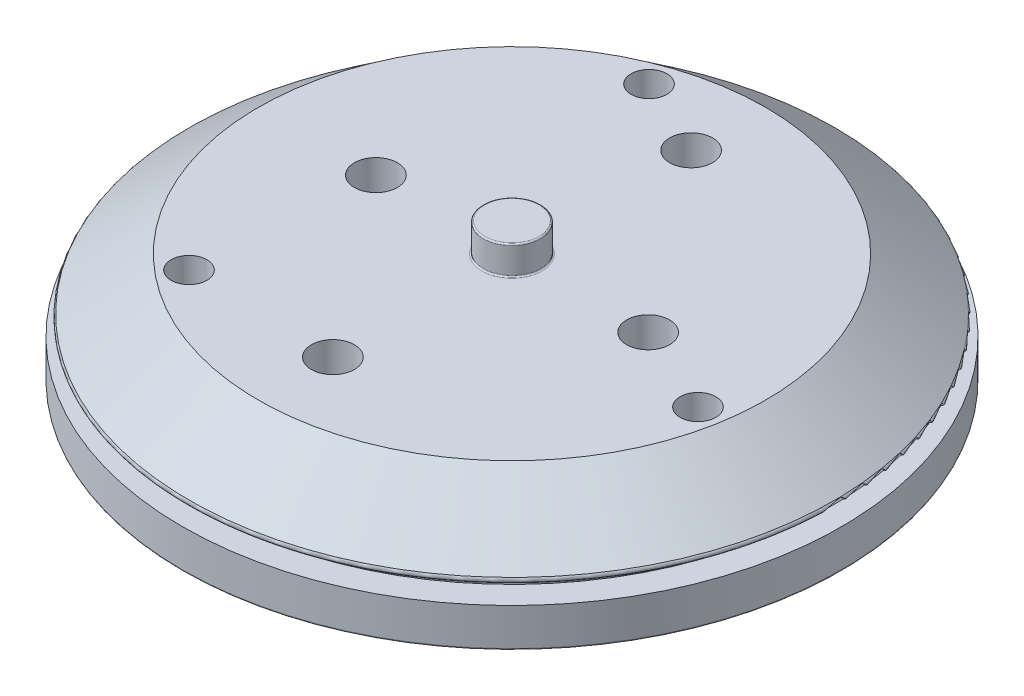
ISO-10303-21;
HEADER;
FILE_DESCRIPTION(('STEP AP214'),'2;1');
FILE_NAME('part.step','',(''),(''),'','','');
FILE_SCHEMA(('AUTOMOTIVE_DESIGN { 1 0 10303 214 1 1 1 1 }'));
ENDSEC;
DATA;
#1=APPLICATION_CONTEXT('core data for automotive mechanical design processes');
#2=APPLICATION_PROTOCOL_DEFINITION('international standard','automotive_design',2000,#1);
#3=PRODUCT_CONTEXT('',#1,'mechanical');
#4=PRODUCT('Part','Part','',(#3));
#5=PRODUCT_RELATED_PRODUCT_CATEGORY('part','',(#4));
#6=PRODUCT_DEFINITION_FORMATION('','',#4);
#7=PRODUCT_DEFINITION_CONTEXT('part definition',#1,'design');
#8=PRODUCT_DEFINITION('design','',#6,#7);
#9=PRODUCT_DEFINITION_SHAPE('','',#8);
#10=(LENGTH_UNIT() NAMED_UNIT(*) SI_UNIT(.MILLI.,.METRE.));
#11=(NAMED_UNIT(*) PLANE_ANGLE_UNIT() SI_UNIT($,.RADIAN.));
#12=(NAMED_UNIT(*) SI_UNIT($,.STERADIAN.) SOLID_ANGLE_UNIT());
#13=UNCERTAINTY_MEASURE_WITH_UNIT(LENGTH_MEASURE(1.E-05),#10,'distance_accuracy_value','');
#14=(GEOMETRIC_REPRESENTATION_CONTEXT(3) GLOBAL_UNCERTAINTY_ASSIGNED_CONTEXT((#13)) GLOBAL_UNIT_ASSIGNED_CONTEXT((#10,
#11,#12)) REPRESENTATION_CONTEXT('',''));
#15=CARTESIAN_POINT('',(0.,0.,0.));
#16=DIRECTION('',(0.,0.,1.));
#17=DIRECTION('',(1.,0.,0.));
#18=AXIS2_PLACEMENT_3D('',#15,#16,#17);
#19=CARTESIAN_POINT('',(0.,2.,0.));
#20=DIRECTION('',(0.,1.,0.));
#21=DIRECTION('',(0.,0.,1.));
#22=AXIS2_PLACEMENT_3D('',#19,#20,#21);
#23=PLANE('',#22);
#24=CARTESIAN_POINT('',(0.,2.,0.));
#25=DIRECTION('',(0.,-1.,0.));
#26=DIRECTION('',(0.,0.,-1.));
#27=AXIS2_PLACEMENT_3D('',#24,#25,#26);
#28=CIRCLE('',#27,1.9);
#29=CARTESIAN_POINT('',(0.,2.,-1.9));
#30=VERTEX_POINT('',#29);
#31=CARTESIAN_POINT('',(0.,2.,1.9));
#32=VERTEX_POINT('',#31);
#33=EDGE_CURVE('E66',#30,#32,#28,.T.);
#34=ORIENTED_EDGE('',*,*,#33,.F.);
#35=CARTESIAN_POINT('',(0.,2.,0.));
#36=DIRECTION('',(0.,-1.,0.));
#37=DIRECTION('',(0.,0.,1.));
#38=AXIS2_PLACEMENT_3D('',#35,#36,#37);
#39=CIRCLE('',#38,1.9);
#40=EDGE_CURVE('E64',#32,#30,#39,.T.);
#41=ORIENTED_EDGE('',*,*,#40,.F.);
#42=EDGE_LOOP('',(#34,#41));
#43=FACE_BOUND('',#42,.T.);
#44=ADVANCED_FACE('F24',(#43),#23,.T.);
#45=CARTESIAN_POINT('',(0.,1.9,0.));
#46=DIRECTION('',(0.,1.,0.));
#47=DIRECTION('',(0.,0.,1.));
#48=AXIS2_PLACEMENT_3D('',#45,#46,#47);
#49=TOROIDAL_SURFACE('',#48,1.9,0.1);
#50=ORIENTED_EDGE('',*,*,#40,.T.);
#51=ORIENTED_EDGE('',*,*,#33,.T.);
#52=EDGE_LOOP('',(#50,#51));
#53=FACE_BOUND('',#52,.T.);
#54=CARTESIAN_POINT('',(0.,1.9,0.));
#55=DIRECTION('',(0.,-1.,0.));
#56=DIRECTION('',(0.,0.,-1.));
#57=AXIS2_PLACEMENT_3D('',#54,#55,#56);
#58=CIRCLE('',#57,2.);
#59=CARTESIAN_POINT('',(0.,1.9,-2.));
#60=VERTEX_POINT('',#59);
#61=EDGE_CURVE('E94',#60,#60,#58,.T.);
#62=ORIENTED_EDGE('',*,*,#61,.F.);
#63=EDGE_LOOP('',(#62));
#64=FACE_BOUND('',#63,.T.);
#65=ADVANCED_FACE('F68',(#53,#64),#49,.T.);
#66=CARTESIAN_POINT('',(0.,-4.,17.7));
#67=DIRECTION('',(0.,-1.,0.));
#68=DIRECTION('',(0.,0.,-1.));
#69=AXIS2_PLACEMENT_3D('',#66,#67,#68);
#70=PLANE('',#69);
#71=CARTESIAN_POINT('',(0.,-4.,0.));
#72=DIRECTION('',(0.,1.,0.));
#73=DIRECTION('',(0.,0.,1.));
#74=AXIS2_PLACEMENT_3D('',#71,#72,#73);
#75=CIRCLE('',#74,22.4029984939793);
#76=CARTESIAN_POINT('',(0.,-4.,22.4029984939793));
#77=VERTEX_POINT('',#76);
#78=CARTESIAN_POINT('',(0.,-4.,-22.4029984939793));
#79=VERTEX_POINT('',#78);
#80=EDGE_CURVE('E164',#77,#79,#75,.T.);
#81=ORIENTED_EDGE('',*,*,#80,.F.);
#82=CARTESIAN_POINT('',(0.,-4.,0.));
#83=DIRECTION('',(0.,1.,0.));
#84=DIRECTION('',(0.,0.,-1.));
#85=AXIS2_PLACEMENT_3D('',#82,#83,#84);
#86=CIRCLE('',#85,22.4029984939793);
#87=EDGE_CURVE('E257',#79,#77,#86,.T.);
#88=ORIENTED_EDGE('',*,*,#87,.F.);
#89=EDGE_LOOP('',(#81,#88));
#90=FACE_BOUND('',#89,.T.);
#91=CARTESIAN_POINT('',(0.,-4.,0.));
#92=DIRECTION('',(0.,1.,0.));
#93=DIRECTION('',(0.,0.,1.));
#94=AXIS2_PLACEMENT_3D('',#91,#92,#93);
#95=CIRCLE('',#94,21.2);
#96=CARTESIAN_POINT('',(0.,-4.,21.2));
#97=VERTEX_POINT('',#96);
#98=EDGE_CURVE('E72',#97,#97,#95,.F.);
#99=ORIENTED_EDGE('',*,*,#98,.F.);
#100=EDGE_LOOP('',(#99));
#101=FACE_BOUND('',#100,.T.);
#102=ADVANCED_FACE('F99',(#90,#101),#70,.T.);
#103=CARTESIAN_POINT('',(0.,-5.,0.));
#104=DIRECTION('',(0.,1.,0.));
#105=DIRECTION('',(0.,0.,1.));
#106=AXIS2_PLACEMENT_3D('',#103,#104,#105);
#107=CYLINDRICAL_SURFACE('',#106,21.2);
#108=CARTESIAN_POINT('',(0.,-5.,0.));
#109=DIRECTION('',(0.,1.,0.));
#110=DIRECTION('',(0.,0.,1.));
#111=AXIS2_PLACEMENT_3D('',#108,#109,#110);
#112=CIRCLE('',#111,21.2);
#113=CARTESIAN_POINT('',(0.,-5.,21.2));
#114=VERTEX_POINT('',#113);
#115=EDGE_CURVE('E160',#114,#114,#112,.F.);
#116=ORIENTED_EDGE('',*,*,#115,.F.);
#117=EDGE_LOOP('',(#116));
#118=FACE_BOUND('',#117,.T.);
#119=ORIENTED_EDGE('',*,*,#98,.T.);
#120=EDGE_LOOP('',(#119));
#121=FACE_BOUND('',#120,.T.);
#122=ADVANCED_FACE('F308',(#118,#121),#107,.T.);
#123=CARTESIAN_POINT('',(0.,2.,0.));
#124=DIRECTION('',(0.,-1.,0.));
#125=DIRECTION('',(0.,0.,-1.));
#126=AXIS2_PLACEMENT_3D('',#123,#124,#125);
#127=CYLINDRICAL_SURFACE('',#126,2.);
#128=CARTESIAN_POINT('',(0.,0.1,0.));
#129=DIRECTION('',(0.,1.,0.));
#130=DIRECTION('',(0.,0.,1.));
#131=AXIS2_PLACEMENT_3D('',#128,#129,#130);
#132=CIRCLE('',#131,2.);
#133=CARTESIAN_POINT('',(0.,0.1,2.));
#134=VERTEX_POINT('',#133);
#135=EDGE_CURVE('E163',#134,#134,#132,.T.);
#136=ORIENTED_EDGE('',*,*,#135,.T.);
#137=EDGE_LOOP('',(#136));
#138=FACE_BOUND('',#137,.T.);
#139=ORIENTED_EDGE('',*,*,#61,.T.);
#140=EDGE_LOOP('',(#139));
#141=FACE_BOUND('',#140,.T.);
#142=ADVANCED_FACE('F271',(#138,#141),#127,.T.);
#143=CARTESIAN_POINT('',(0.,-3.8,0.));
#144=DIRECTION('',(0.,-1.,0.));
#145=DIRECTION('',(0.,0.,-1.));
#146=AXIS2_PLACEMENT_3D('',#143,#144,#145);
#147=TOROIDAL_SURFACE('',#146,22.4029984939793,0.2);
#148=ORIENTED_EDGE('',*,*,#87,.T.);
#149=ORIENTED_EDGE('',*,*,#80,.T.);
#150=EDGE_LOOP('',(#148,#149));
#151=FACE_BOUND('',#150,.T.);
#152=CARTESIAN_POINT('',(0.,-3.64036216993335,0.));
#153=DIRECTION('',(0.,-1.,0.));
#154=DIRECTION('',(0.,0.,-1.));
#155=AXIS2_PLACEMENT_3D('',#152,#153,#154);
#156=CIRCLE('',#155,22.5234798751617);
#157=CARTESIAN_POINT('',(0.,-3.64036216993335,-22.5234798751617));
#158=VERTEX_POINT('',#157);
#159=EDGE_CURVE('E159',#158,#158,#156,.F.);
#160=ORIENTED_EDGE('',*,*,#159,.F.);
#161=EDGE_LOOP('',(#160));
#162=FACE_BOUND('',#161,.T.);
#163=ADVANCED_FACE('F261',(#151,#162),#147,.T.);
#164=CARTESIAN_POINT('',(0.,-5.,0.));
#165=DIRECTION('',(0.,1.,0.));
#166=DIRECTION('',(0.,0.,1.));
#167=AXIS2_PLACEMENT_3D('',#164,#165,#166);
#168=PLANE('',#167);
#169=CARTESIAN_POINT('',(0.,-5.,0.));
#170=DIRECTION('',(0.,1.,0.));
#171=DIRECTION('',(0.,0.,1.));
#172=AXIS2_PLACEMENT_3D('',#169,#170,#171);
#173=CIRCLE('',#172,23.);
#174=CARTESIAN_POINT('',(0.,-5.,23.));
#175=VERTEX_POINT('',#174);
#176=EDGE_CURVE('E155',#175,#175,#173,.F.);
#177=ORIENTED_EDGE('',*,*,#176,.F.);
#178=EDGE_LOOP('',(#177));
#179=FACE_BOUND('',#178,.T.);
#180=ORIENTED_EDGE('',*,*,#115,.T.);
#181=EDGE_LOOP('',(#180));
#182=FACE_BOUND('',#181,.T.);
#183=ADVANCED_FACE('F239',(#179,#182),#168,.T.);
#184=CARTESIAN_POINT('',(0.,0.1,0.));
#185=DIRECTION('',(0.,1.,0.));
#186=DIRECTION('',(0.,0.,1.));
#187=AXIS2_PLACEMENT_3D('',#184,#185,#186);
#188=TOROIDAL_SURFACE('',#187,2.1,0.1);
#189=ORIENTED_EDGE('',*,*,#135,.F.);
#190=EDGE_LOOP('',(#189));
#191=FACE_BOUND('',#190,.T.);
#192=CARTESIAN_POINT('',(0.,0.,0.));
#193=DIRECTION('',(0.,1.,0.));
#194=DIRECTION('',(0.,0.,-1.));
#195=AXIS2_PLACEMENT_3D('',#192,#193,#194);
#196=CIRCLE('',#195,2.1);
#197=CARTESIAN_POINT('',(0.,0.,2.1));
#198=VERTEX_POINT('',#197);
#199=CARTESIAN_POINT('',(0.,0.,-2.1));
#200=VERTEX_POINT('',#199);
#201=EDGE_CURVE('E158',#198,#200,#196,.F.);
#202=ORIENTED_EDGE('',*,*,#201,.F.);
#203=CARTESIAN_POINT('',(0.,0.,0.));
#204=DIRECTION('',(0.,1.,0.));
#205=DIRECTION('',(0.,0.,1.));
#206=AXIS2_PLACEMENT_3D('',#203,#204,#205);
#207=CIRCLE('',#206,2.1);
#208=EDGE_CURVE('E154',#200,#198,#207,.F.);
#209=ORIENTED_EDGE('',*,*,#208,.F.);
#210=EDGE_LOOP('',(#202,#209));
#211=FACE_BOUND('',#210,.T.);
#212=ADVANCED_FACE('F233',(#191,#211),#188,.F.);
#213=CARTESIAN_POINT('',(0.,-3.64036216993335,0.));
#214=DIRECTION('',(0.,-1.,0.));
#215=DIRECTION('',(0.,0.,-1.));
#216=AXIS2_PLACEMENT_3D('',#213,#214,#215);
#217=CONICAL_SURFACE('',#216,22.5234798751617,0.924283178917661);
#218=ORIENTED_EDGE('',*,*,#159,.T.);
#219=EDGE_LOOP('',(#218));
#220=FACE_BOUND('',#219,.T.);
#221=CARTESIAN_POINT('',(0.,0.,0.));
#222=DIRECTION('',(0.,-1.,0.));
#223=DIRECTION('',(0.,0.,-1.));
#224=AXIS2_PLACEMENT_3D('',#221,#222,#223);
#225=CIRCLE('',#224,17.7);
#226=CARTESIAN_POINT('',(0.,0.,-17.7));
#227=VERTEX_POINT('',#226);
#228=EDGE_CURVE('E151',#227,#227,#225,.F.);
#229=ORIENTED_EDGE('',*,*,#228,.F.);
#230=EDGE_LOOP('',(#229));
#231=FACE_BOUND('',#230,.T.);
#232=ADVANCED_FACE('F238',(#220,#231),#217,.T.);
#233=CARTESIAN_POINT('',(0.,-7.7,0.));
#234=DIRECTION('',(0.,1.,0.));
#235=DIRECTION('',(0.,0.,1.));
#236=AXIS2_PLACEMENT_3D('',#233,#234,#235);
#237=CYLINDRICAL_SURFACE('',#236,23.);
#238=CARTESIAN_POINT('',(0.,-7.6,0.));
#239=DIRECTION('',(0.,1.,0.));
#240=DIRECTION('',(0.,0.,1.));
#241=AXIS2_PLACEMENT_3D('',#238,#239,#240);
#242=CIRCLE('',#241,23.);
#243=CARTESIAN_POINT('',(0.,-7.6,23.));
#244=VERTEX_POINT('',#243);
#245=EDGE_CURVE('E150',#244,#244,#242,.F.);
#246=ORIENTED_EDGE('',*,*,#245,.F.);
#247=EDGE_LOOP('',(#246));
#248=FACE_BOUND('',#247,.T.);
#249=ORIENTED_EDGE('',*,*,#176,.T.);
#250=EDGE_LOOP('',(#249));
#251=FACE_BOUND('',#250,.T.);
#252=ADVANCED_FACE('F366',(#248,#251),#237,.T.);
#253=CARTESIAN_POINT('',(0.,0.,0.));
#254=DIRECTION('',(0.,1.,0.));
#255=DIRECTION('',(0.,0.,1.));
#256=AXIS2_PLACEMENT_3D('',#253,#254,#255);
#257=PLANE('',#256);
#258=ORIENTED_EDGE('',*,*,#228,.T.);
#259=EDGE_LOOP('',(#258));
#260=FACE_BOUND('',#259,.T.);
#261=CARTESIAN_POINT('',(-5.47232229321071,0.,-15.0350819325745));
#262=DIRECTION('',(0.,1.,0.));
#263=DIRECTION('',(0.,0.,1.));
#264=AXIS2_PLACEMENT_3D('',#261,#262,#263);
#265=CIRCLE('',#264,1.25);
#266=CARTESIAN_POINT('',(-5.47232229321071,0.,-13.7850819325745));
#267=VERTEX_POINT('',#266);
#268=EDGE_CURVE('E128',#267,#267,#265,.F.);
#269=ORIENTED_EDGE('',*,*,#268,.T.);
#270=EDGE_LOOP('',(#269));
#271=FACE_BOUND('',#270,.T.);
#272=CARTESIAN_POINT('',(15.7569240481954,0.,2.77837084267073));
#273=DIRECTION('',(0.,1.,0.));
#274=DIRECTION('',(0.,0.,1.));
#275=AXIS2_PLACEMENT_3D('',#272,#273,#274);
#276=CIRCLE('',#275,1.25);
#277=CARTESIAN_POINT('',(15.7569240481954,0.,4.02837084267073));
#278=VERTEX_POINT('',#277);
#279=EDGE_CURVE('E132',#278,#278,#276,.F.);
#280=ORIENTED_EDGE('',*,*,#279,.T.);
#281=EDGE_LOOP('',(#280));
#282=FACE_BOUND('',#281,.T.);
#283=CARTESIAN_POINT('',(-10.2846017549846,0.,12.2567110899037));
#284=DIRECTION('',(0.,1.,0.));
#285=DIRECTION('',(0.,0.,1.));
#286=AXIS2_PLACEMENT_3D('',#283,#284,#285);
#287=CIRCLE('',#286,1.25);
#288=CARTESIAN_POINT('',(-10.2846017549846,0.,13.5067110899037));
#289=VERTEX_POINT('',#288);
#290=EDGE_CURVE('E135',#289,#289,#287,.F.);
#291=ORIENTED_EDGE('',*,*,#290,.T.);
#292=EDGE_LOOP('',(#291));
#293=FACE_BOUND('',#292,.T.);
#294=CARTESIAN_POINT('',(0.,0.,-12.5));
#295=DIRECTION('',(0.,1.,0.));
#296=DIRECTION('',(0.,0.,1.));
#297=AXIS2_PLACEMENT_3D('',#294,#295,#296);
#298=CIRCLE('',#297,1.5);
#299=CARTESIAN_POINT('',(0.,0.,-11.));
#300=VERTEX_POINT('',#299);
#301=EDGE_CURVE('E138',#300,#300,#298,.F.);
#302=ORIENTED_EDGE('',*,*,#301,.T.);
#303=EDGE_LOOP('',(#302));
#304=FACE_BOUND('',#303,.T.);
#305=CARTESIAN_POINT('',(9.5,0.,0.));
#306=DIRECTION('',(0.,1.,0.));
#307=DIRECTION('',(0.,0.,1.));
#308=AXIS2_PLACEMENT_3D('',#305,#306,#307);
#309=CIRCLE('',#308,1.5);
#310=CARTESIAN_POINT('',(9.5,0.,1.5));
#311=VERTEX_POINT('',#310);
#312=EDGE_CURVE('E141',#311,#311,#309,.F.);
#313=ORIENTED_EDGE('',*,*,#312,.T.);
#314=EDGE_LOOP('',(#313));
#315=FACE_BOUND('',#314,.T.);
#316=CARTESIAN_POINT('',(-9.5,0.,0.));
#317=DIRECTION('',(0.,1.,0.));
#318=DIRECTION('',(0.,0.,1.));
#319=AXIS2_PLACEMENT_3D('',#316,#317,#318);
#320=CIRCLE('',#319,1.5);
#321=CARTESIAN_POINT('',(-9.5,0.,1.5));
#322=VERTEX_POINT('',#321);
#323=EDGE_CURVE('E144',#322,#322,#320,.F.);
#324=ORIENTED_EDGE('',*,*,#323,.T.);
#325=EDGE_LOOP('',(#324));
#326=FACE_BOUND('',#325,.T.);
#327=CARTESIAN_POINT('',(0.,0.,12.5));
#328=DIRECTION('',(0.,1.,0.));
#329=DIRECTION('',(0.,0.,1.));
#330=AXIS2_PLACEMENT_3D('',#327,#328,#329);
#331=CIRCLE('',#330,1.5);
#332=CARTESIAN_POINT('',(0.,0.,14.));
#333=VERTEX_POINT('',#332);
#334=EDGE_CURVE('E147',#333,#333,#331,.F.);
#335=ORIENTED_EDGE('',*,*,#334,.T.);
#336=EDGE_LOOP('',(#335));
#337=FACE_BOUND('',#336,.T.);
#338=ORIENTED_EDGE('',*,*,#201,.T.);
#339=ORIENTED_EDGE('',*,*,#208,.T.);
#340=EDGE_LOOP('',(#338,#339));
#341=FACE_BOUND('',#340,.T.);
#342=ADVANCED_FACE('F187',(#260,#271,#282,#293,#304,#315,#326,#337,#341),#257,.T.);
#343=CARTESIAN_POINT('',(0.,-7.6,0.));
#344=DIRECTION('',(0.,1.,0.));
#345=DIRECTION('',(0.,0.,1.));
#346=AXIS2_PLACEMENT_3D('',#343,#344,#345);
#347=TOROIDAL_SURFACE('',#346,22.9,0.1);
#348=CARTESIAN_POINT('',(0.,-7.7,0.));
#349=DIRECTION('',(0.,1.,0.));
#350=DIRECTION('',(0.,0.,1.));
#351=AXIS2_PLACEMENT_3D('',#348,#349,#350);
#352=CIRCLE('',#351,22.9);
#353=CARTESIAN_POINT('',(0.,-7.7,22.9));
#354=VERTEX_POINT('',#353);
#355=CARTESIAN_POINT('',(0.,-7.7,-22.9));
#356=VERTEX_POINT('',#355);
#357=EDGE_CURVE('E131',#354,#356,#352,.T.);
#358=ORIENTED_EDGE('',*,*,#357,.T.);
#359=CARTESIAN_POINT('',(0.,-7.7,0.));
#360=DIRECTION('',(0.,1.,0.));
#361=DIRECTION('',(0.,0.,-1.));
#362=AXIS2_PLACEMENT_3D('',#359,#360,#361);
#363=CIRCLE('',#362,22.9);
#364=EDGE_CURVE('E43',#356,#354,#363,.T.);
#365=ORIENTED_EDGE('',*,*,#364,.T.);
#366=EDGE_LOOP('',(#358,#365));
#367=FACE_BOUND('',#366,.T.);
#368=ORIENTED_EDGE('',*,*,#245,.T.);
#369=EDGE_LOOP('',(#368));
#370=FACE_BOUND('',#369,.T.);
#371=ADVANCED_FACE('F175',(#367,#370),#347,.T.);
#372=CARTESIAN_POINT('',(0.,-7.7,12.5));
#373=DIRECTION('',(0.,1.,0.));
#374=DIRECTION('',(0.,0.,1.));
#375=AXIS2_PLACEMENT_3D('',#372,#373,#374);
#376=CYLINDRICAL_SURFACE('',#375,1.5);
#377=CARTESIAN_POINT('',(0.,-7.7,12.5));
#378=DIRECTION('',(0.,1.,0.));
#379=DIRECTION('',(0.,0.,1.));
#380=AXIS2_PLACEMENT_3D('',#377,#378,#379);
#381=CIRCLE('',#380,1.5);
#382=CARTESIAN_POINT('',(0.,-7.7,14.));
#383=VERTEX_POINT('',#382);
#384=EDGE_CURVE('E125',#383,#383,#381,.F.);
#385=ORIENTED_EDGE('',*,*,#384,.T.);
#386=EDGE_LOOP('',(#385));
#387=FACE_BOUND('',#386,.T.);
#388=ORIENTED_EDGE('',*,*,#334,.F.);
#389=EDGE_LOOP('',(#388));
#390=FACE_BOUND('',#389,.T.);
#391=ADVANCED_FACE('F186',(#387,#390),#376,.F.);
#392=CARTESIAN_POINT('',(-9.5,-7.7,0.));
#393=DIRECTION('',(0.,1.,0.));
#394=DIRECTION('',(0.,0.,1.));
#395=AXIS2_PLACEMENT_3D('',#392,#393,#394);
#396=CYLINDRICAL_SURFACE('',#395,1.5);
#397=CARTESIAN_POINT('',(-9.5,-7.7,0.));
#398=DIRECTION('',(0.,1.,0.));
#399=DIRECTION('',(0.,0.,1.));
#400=AXIS2_PLACEMENT_3D('',#397,#398,#399);
#401=CIRCLE('',#400,1.5);
#402=CARTESIAN_POINT('',(-9.5,-7.7,1.5));
#403=VERTEX_POINT('',#402);
#404=EDGE_CURVE('E122',#403,#403,#401,.F.);
#405=ORIENTED_EDGE('',*,*,#404,.T.);
#406=EDGE_LOOP('',(#405));
#407=FACE_BOUND('',#406,.T.);
#408=ORIENTED_EDGE('',*,*,#323,.F.);
#409=EDGE_LOOP('',(#408));
#410=FACE_BOUND('',#409,.T.);
#411=ADVANCED_FACE('F352',(#407,#410),#396,.F.);
#412=CARTESIAN_POINT('',(9.5,-7.7,0.));
#413=DIRECTION('',(0.,1.,0.));
#414=DIRECTION('',(0.,0.,1.));
#415=AXIS2_PLACEMENT_3D('',#412,#413,#414);
#416=CYLINDRICAL_SURFACE('',#415,1.5);
#417=CARTESIAN_POINT('',(9.5,-7.7,0.));
#418=DIRECTION('',(0.,1.,0.));
#419=DIRECTION('',(0.,0.,1.));
#420=AXIS2_PLACEMENT_3D('',#417,#418,#419);
#421=CIRCLE('',#420,1.5);
#422=CARTESIAN_POINT('',(9.5,-7.7,1.5));
#423=VERTEX_POINT('',#422);
#424=EDGE_CURVE('E119',#423,#423,#421,.F.);
#425=ORIENTED_EDGE('',*,*,#424,.T.);
#426=EDGE_LOOP('',(#425));
#427=FACE_BOUND('',#426,.T.);
#428=ORIENTED_EDGE('',*,*,#312,.F.);
#429=EDGE_LOOP('',(#428));
#430=FACE_BOUND('',#429,.T.);
#431=ADVANCED_FACE('F349',(#427,#430),#416,.F.);
#432=CARTESIAN_POINT('',(0.,-7.7,-12.5));
#433=DIRECTION('',(0.,1.,0.));
#434=DIRECTION('',(0.,0.,1.));
#435=AXIS2_PLACEMENT_3D('',#432,#433,#434);
#436=CYLINDRICAL_SURFACE('',#435,1.5);
#437=CARTESIAN_POINT('',(0.,-7.7,-12.5));
#438=DIRECTION('',(0.,1.,0.));
#439=DIRECTION('',(0.,0.,1.));
#440=AXIS2_PLACEMENT_3D('',#437,#438,#439);
#441=CIRCLE('',#440,1.5);
#442=CARTESIAN_POINT('',(0.,-7.7,-11.));
#443=VERTEX_POINT('',#442);
#444=EDGE_CURVE('E116',#443,#443,#441,.F.);
#445=ORIENTED_EDGE('',*,*,#444,.T.);
#446=EDGE_LOOP('',(#445));
#447=FACE_BOUND('',#446,.T.);
#448=ORIENTED_EDGE('',*,*,#301,.F.);
#449=EDGE_LOOP('',(#448));
#450=FACE_BOUND('',#449,.T.);
#451=ADVANCED_FACE('F345',(#447,#450),#436,.F.);
#452=CARTESIAN_POINT('',(-10.2846017549846,-7.7,12.2567110899037));
#453=DIRECTION('',(0.,1.,0.));
#454=DIRECTION('',(0.,0.,1.));
#455=AXIS2_PLACEMENT_3D('',#452,#453,#454);
#456=CYLINDRICAL_SURFACE('',#455,1.25);
#457=CARTESIAN_POINT('',(-10.2846017549846,-7.7,12.2567110899037));
#458=DIRECTION('',(0.,1.,0.));
#459=DIRECTION('',(0.,0.,1.));
#460=AXIS2_PLACEMENT_3D('',#457,#458,#459);
#461=CIRCLE('',#460,1.25);
#462=CARTESIAN_POINT('',(-10.2846017549846,-7.7,13.5067110899037));
#463=VERTEX_POINT('',#462);
#464=EDGE_CURVE('E113',#463,#463,#461,.F.);
#465=ORIENTED_EDGE('',*,*,#464,.T.);
#466=EDGE_LOOP('',(#465));
#467=FACE_BOUND('',#466,.T.);
#468=ORIENTED_EDGE('',*,*,#290,.F.);
#469=EDGE_LOOP('',(#468));
#470=FACE_BOUND('',#469,.T.);
#471=ADVANCED_FACE('F341',(#467,#470),#456,.F.);
#472=CARTESIAN_POINT('',(15.7569240481954,-7.7,2.77837084267073));
#473=DIRECTION('',(0.,1.,0.));
#474=DIRECTION('',(0.,0.,1.));
#475=AXIS2_PLACEMENT_3D('',#472,#473,#474);
#476=CYLINDRICAL_SURFACE('',#475,1.25);
#477=CARTESIAN_POINT('',(15.7569240481954,-7.7,2.77837084267073));
#478=DIRECTION('',(0.,1.,0.));
#479=DIRECTION('',(0.,0.,1.));
#480=AXIS2_PLACEMENT_3D('',#477,#478,#479);
#481=CIRCLE('',#480,1.25);
#482=CARTESIAN_POINT('',(15.7569240481954,-7.7,4.02837084267073));
#483=VERTEX_POINT('',#482);
#484=EDGE_CURVE('E35',#483,#483,#481,.F.);
#485=ORIENTED_EDGE('',*,*,#484,.T.);
#486=EDGE_LOOP('',(#485));
#487=FACE_BOUND('',#486,.T.);
#488=ORIENTED_EDGE('',*,*,#279,.F.);
#489=EDGE_LOOP('',(#488));
#490=FACE_BOUND('',#489,.T.);
#491=ADVANCED_FACE('F322',(#487,#490),#476,.F.);
#492=CARTESIAN_POINT('',(-5.47232229321071,-7.7,-15.0350819325745));
#493=DIRECTION('',(0.,1.,0.));
#494=DIRECTION('',(0.,0.,1.));
#495=AXIS2_PLACEMENT_3D('',#492,#493,#494);
#496=CYLINDRICAL_SURFACE('',#495,1.25);
#497=CARTESIAN_POINT('',(-5.47232229321071,-7.7,-15.0350819325745));
#498=DIRECTION('',(0.,1.,0.));
#499=DIRECTION('',(0.,0.,1.));
#500=AXIS2_PLACEMENT_3D('',#497,#498,#499);
#501=CIRCLE('',#500,1.25);
#502=CARTESIAN_POINT('',(-5.47232229321071,-7.7,-13.7850819325745));
#503=VERTEX_POINT('',#502);
#504=EDGE_CURVE('E13',#503,#503,#501,.F.);
#505=ORIENTED_EDGE('',*,*,#504,.T.);
#506=EDGE_LOOP('',(#505));
#507=FACE_BOUND('',#506,.T.);
#508=ORIENTED_EDGE('',*,*,#268,.F.);
#509=EDGE_LOOP('',(#508));
#510=FACE_BOUND('',#509,.T.);
#511=ADVANCED_FACE('F317',(#507,#510),#496,.F.);
#512=CARTESIAN_POINT('',(0.,-7.7,0.));
#513=DIRECTION('',(0.,1.,0.));
#514=DIRECTION('',(0.,0.,1.));
#515=AXIS2_PLACEMENT_3D('',#512,#513,#514);
#516=PLANE('',#515);
#517=ORIENTED_EDGE('',*,*,#504,.F.);
#518=EDGE_LOOP('',(#517));
#519=FACE_BOUND('',#518,.T.);
#520=ORIENTED_EDGE('',*,*,#484,.F.);
#521=EDGE_LOOP('',(#520));
#522=FACE_BOUND('',#521,.T.);
#523=ORIENTED_EDGE('',*,*,#464,.F.);
#524=EDGE_LOOP('',(#523));
#525=FACE_BOUND('',#524,.T.);
#526=ORIENTED_EDGE('',*,*,#444,.F.);
#527=EDGE_LOOP('',(#526));
#528=FACE_BOUND('',#527,.T.);
#529=ORIENTED_EDGE('',*,*,#424,.F.);
#530=EDGE_LOOP('',(#529));
#531=FACE_BOUND('',#530,.T.);
#532=ORIENTED_EDGE('',*,*,#404,.F.);
#533=EDGE_LOOP('',(#532));
#534=FACE_BOUND('',#533,.T.);
#535=ORIENTED_EDGE('',*,*,#384,.F.);
#536=EDGE_LOOP('',(#535));
#537=FACE_BOUND('',#536,.T.);
#538=ORIENTED_EDGE('',*,*,#357,.F.);
#539=ORIENTED_EDGE('',*,*,#364,.F.);
#540=EDGE_LOOP('',(#538,#539));
#541=FACE_BOUND('',#540,.T.);
#542=ADVANCED_FACE('F315',(#519,#522,#525,#528,#531,#534,#537,#541),#516,.F.);
#543=CLOSED_SHELL('',(#44,#65,#102,#122,#142,#163,#183,#212,#232,#252,#342,#371,#391,#411,#431,
#451,#471,#491,#511,#542));
#544=MANIFOLD_SOLID_BREP('B1',#543);
#545=ADVANCED_BREP_SHAPE_REPRESENTATION('',(#18,#544),#14);
#546=SHAPE_DEFINITION_REPRESENTATION(#9,#545);
ENDSEC;
END-ISO-10303-21;
